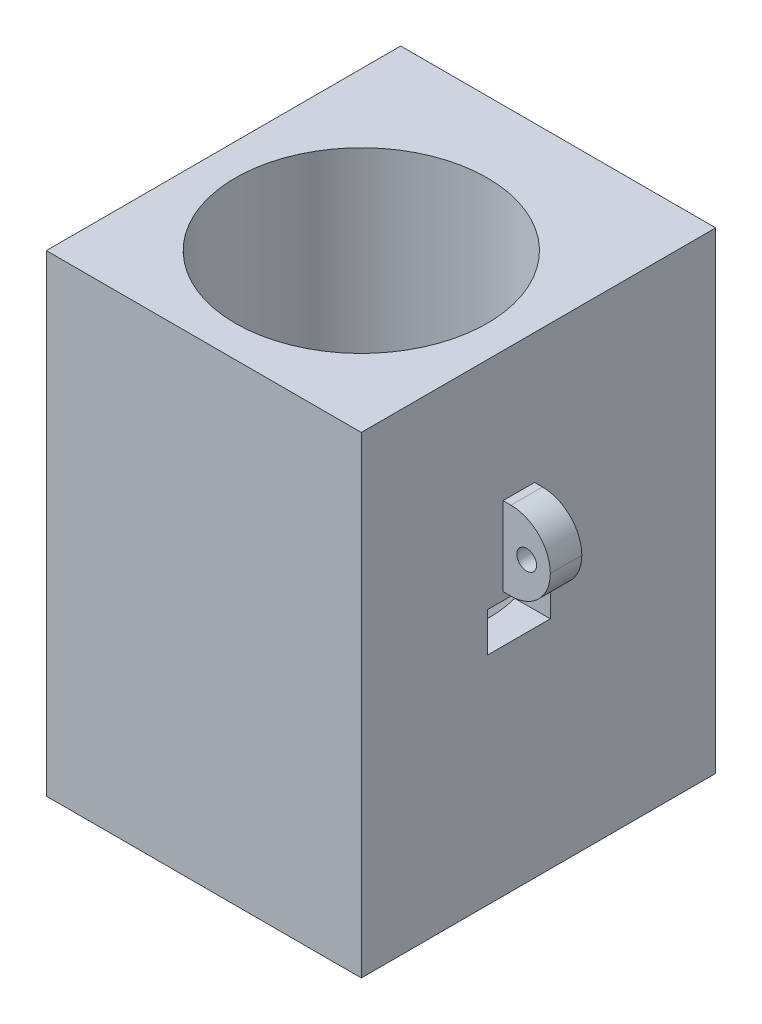
ISO-10303-21;
HEADER;
FILE_DESCRIPTION(('STEP AP214'),'2;1');
FILE_NAME('part.step','',(''),(''),'','','');
FILE_SCHEMA(('AUTOMOTIVE_DESIGN { 1 0 10303 214 1 1 1 1 }'));
ENDSEC;
DATA;
#1=APPLICATION_CONTEXT('core data for automotive mechanical design processes');
#2=APPLICATION_PROTOCOL_DEFINITION('international standard','automotive_design',2000,#1);
#3=PRODUCT_CONTEXT('',#1,'mechanical');
#4=PRODUCT('Part','Part','',(#3));
#5=PRODUCT_RELATED_PRODUCT_CATEGORY('part','',(#4));
#6=PRODUCT_DEFINITION_FORMATION('','',#4);
#7=PRODUCT_DEFINITION_CONTEXT('part definition',#1,'design');
#8=PRODUCT_DEFINITION('design','',#6,#7);
#9=PRODUCT_DEFINITION_SHAPE('','',#8);
#10=(LENGTH_UNIT() NAMED_UNIT(*) SI_UNIT(.MILLI.,.METRE.));
#11=(NAMED_UNIT(*) PLANE_ANGLE_UNIT() SI_UNIT($,.RADIAN.));
#12=(NAMED_UNIT(*) SI_UNIT($,.STERADIAN.) SOLID_ANGLE_UNIT());
#13=UNCERTAINTY_MEASURE_WITH_UNIT(LENGTH_MEASURE(1.E-05),#10,'distance_accuracy_value','');
#14=(GEOMETRIC_REPRESENTATION_CONTEXT(3) GLOBAL_UNCERTAINTY_ASSIGNED_CONTEXT((#13)) GLOBAL_UNIT_ASSIGNED_CONTEXT((#10,
#11,#12)) REPRESENTATION_CONTEXT('',''));
#15=CARTESIAN_POINT('',(0.,0.,0.));
#16=DIRECTION('',(0.,0.,1.));
#17=DIRECTION('',(1.,0.,0.));
#18=AXIS2_PLACEMENT_3D('',#15,#16,#17);
#19=CARTESIAN_POINT('',(20.,30.,-25.));
#20=DIRECTION('',(-1.,0.,0.));
#21=DIRECTION('',(0.,0.,1.));
#22=AXIS2_PLACEMENT_3D('',#19,#20,#21);
#23=PLANE('',#22);
#24=DIRECTION('',(0.,0.,-1.));
#25=VECTOR('',#24,1.);
#26=CARTESIAN_POINT('',(20.,-30.,-25.));
#27=LINE('',#26,#25);
#28=CARTESIAN_POINT('',(20.,-30.,20.));
#29=VERTEX_POINT('',#28);
#30=CARTESIAN_POINT('',(20.,-30.,-25.));
#31=VERTEX_POINT('',#30);
#32=EDGE_CURVE('E300',#29,#31,#27,.T.);
#33=ORIENTED_EDGE('',*,*,#32,.T.);
#34=DIRECTION('',(0.,-1.,0.));
#35=VECTOR('',#34,1.);
#36=CARTESIAN_POINT('',(20.,30.,-25.));
#37=LINE('',#36,#35);
#38=CARTESIAN_POINT('',(20.,30.,-25.));
#39=VERTEX_POINT('',#38);
#40=EDGE_CURVE('E305',#39,#31,#37,.T.);
#41=ORIENTED_EDGE('',*,*,#40,.F.);
#42=DIRECTION('',(0.,0.,-1.));
#43=VECTOR('',#42,1.);
#44=CARTESIAN_POINT('',(20.,30.,-25.));
#45=LINE('',#44,#43);
#46=CARTESIAN_POINT('',(20.,30.,20.));
#47=VERTEX_POINT('',#46);
#48=EDGE_CURVE('E291',#47,#39,#45,.T.);
#49=ORIENTED_EDGE('',*,*,#48,.F.);
#50=DIRECTION('',(0.,-1.,0.));
#51=VECTOR('',#50,1.);
#52=CARTESIAN_POINT('',(20.,30.,20.));
#53=LINE('',#52,#51);
#54=EDGE_CURVE('E308',#47,#29,#53,.T.);
#55=ORIENTED_EDGE('',*,*,#54,.T.);
#56=EDGE_LOOP('',(#33,#41,#49,#55));
#57=FACE_BOUND('',#56,.T.);
#58=DIRECTION('',(0.,0.,-1.));
#59=VECTOR('',#58,1.);
#60=CARTESIAN_POINT('',(20.,2.5,-25.));
#61=LINE('',#60,#59);
#62=CARTESIAN_POINT('',(20.,2.5,4.));
#63=VERTEX_POINT('',#62);
#64=CARTESIAN_POINT('',(20.,2.5,-4.));
#65=VERTEX_POINT('',#64);
#66=EDGE_CURVE('E254',#63,#65,#61,.T.);
#67=ORIENTED_EDGE('',*,*,#66,.T.);
#68=DIRECTION('',(0.,-1.,0.));
#69=VECTOR('',#68,1.);
#70=CARTESIAN_POINT('',(20.,30.,-4.));
#71=LINE('',#70,#69);
#72=CARTESIAN_POINT('',(20.,-2.5,-4.));
#73=VERTEX_POINT('',#72);
#74=EDGE_CURVE('E272',#65,#73,#71,.T.);
#75=ORIENTED_EDGE('',*,*,#74,.T.);
#76=DIRECTION('',(0.,0.,1.));
#77=VECTOR('',#76,1.);
#78=CARTESIAN_POINT('',(20.,-2.5,-25.));
#79=LINE('',#78,#77);
#80=CARTESIAN_POINT('',(20.,-2.5,4.));
#81=VERTEX_POINT('',#80);
#82=EDGE_CURVE('E266',#73,#81,#79,.T.);
#83=ORIENTED_EDGE('',*,*,#82,.T.);
#84=DIRECTION('',(0.,1.,0.));
#85=VECTOR('',#84,1.);
#86=CARTESIAN_POINT('',(20.,30.,4.));
#87=LINE('',#86,#85);
#88=EDGE_CURVE('E260',#81,#63,#87,.T.);
#89=ORIENTED_EDGE('',*,*,#88,.T.);
#90=EDGE_LOOP('',(#67,#75,#83,#89));
#91=FACE_BOUND('',#90,.T.);
#92=DIRECTION('',(0.,0.,-1.));
#93=VECTOR('',#92,1.);
#94=CARTESIAN_POINT('',(20.,13.5,2.));
#95=LINE('',#94,#93);
#96=CARTESIAN_POINT('',(20.,13.5,2.));
#97=VERTEX_POINT('',#96);
#98=CARTESIAN_POINT('',(20.,13.5,-2.));
#99=VERTEX_POINT('',#98);
#100=EDGE_CURVE('E186',#97,#99,#95,.T.);
#101=ORIENTED_EDGE('',*,*,#100,.T.);
#102=DIRECTION('',(0.,-1.,0.));
#103=VECTOR('',#102,1.);
#104=CARTESIAN_POINT('',(20.,3.5,-2.));
#105=LINE('',#104,#103);
#106=CARTESIAN_POINT('',(20.,3.5,-2.));
#107=VERTEX_POINT('',#106);
#108=EDGE_CURVE('E180',#99,#107,#105,.T.);
#109=ORIENTED_EDGE('',*,*,#108,.T.);
#110=DIRECTION('',(0.,0.,-1.));
#111=VECTOR('',#110,1.);
#112=CARTESIAN_POINT('',(20.,3.5,2.));
#113=LINE('',#112,#111);
#114=CARTESIAN_POINT('',(20.,3.5,2.));
#115=VERTEX_POINT('',#114);
#116=EDGE_CURVE('E183',#115,#107,#113,.T.);
#117=ORIENTED_EDGE('',*,*,#116,.F.);
#118=DIRECTION('',(0.,-1.,0.));
#119=VECTOR('',#118,1.);
#120=CARTESIAN_POINT('',(20.,3.5,2.));
#121=LINE('',#120,#119);
#122=EDGE_CURVE('E207',#97,#115,#121,.T.);
#123=ORIENTED_EDGE('',*,*,#122,.F.);
#124=EDGE_LOOP('',(#101,#109,#117,#123));
#125=FACE_BOUND('',#124,.T.);
#126=ADVANCED_FACE('F33',(#57,#91,#125),#23,.F.);
#127=CARTESIAN_POINT('',(-20.,30.,-25.));
#128=DIRECTION('',(1.,0.,0.));
#129=DIRECTION('',(0.,0.,-1.));
#130=AXIS2_PLACEMENT_3D('',#127,#128,#129);
#131=PLANE('',#130);
#132=DIRECTION('',(0.,0.,1.));
#133=VECTOR('',#132,1.);
#134=CARTESIAN_POINT('',(-20.,-30.,-25.));
#135=LINE('',#134,#133);
#136=CARTESIAN_POINT('',(-20.,-30.,-25.));
#137=VERTEX_POINT('',#136);
#138=CARTESIAN_POINT('',(-20.,-30.,20.));
#139=VERTEX_POINT('',#138);
#140=EDGE_CURVE('E282',#137,#139,#135,.T.);
#141=ORIENTED_EDGE('',*,*,#140,.T.);
#142=DIRECTION('',(0.,-1.,0.));
#143=VECTOR('',#142,1.);
#144=CARTESIAN_POINT('',(-20.,30.,20.));
#145=LINE('',#144,#143);
#146=CARTESIAN_POINT('',(-20.,30.,20.));
#147=VERTEX_POINT('',#146);
#148=EDGE_CURVE('E311',#147,#139,#145,.T.);
#149=ORIENTED_EDGE('',*,*,#148,.F.);
#150=DIRECTION('',(0.,0.,1.));
#151=VECTOR('',#150,1.);
#152=CARTESIAN_POINT('',(-20.,30.,-25.));
#153=LINE('',#152,#151);
#154=CARTESIAN_POINT('',(-20.,30.,-25.));
#155=VERTEX_POINT('',#154);
#156=EDGE_CURVE('E285',#155,#147,#153,.T.);
#157=ORIENTED_EDGE('',*,*,#156,.F.);
#158=DIRECTION('',(0.,-1.,0.));
#159=VECTOR('',#158,1.);
#160=CARTESIAN_POINT('',(-20.,30.,-25.));
#161=LINE('',#160,#159);
#162=EDGE_CURVE('E295',#155,#137,#161,.T.);
#163=ORIENTED_EDGE('',*,*,#162,.T.);
#164=EDGE_LOOP('',(#141,#149,#157,#163));
#165=FACE_BOUND('',#164,.T.);
#166=DIRECTION('',(0.,0.,-1.));
#167=VECTOR('',#166,1.);
#168=CARTESIAN_POINT('',(-20.,-2.5,-25.));
#169=LINE('',#168,#167);
#170=CARTESIAN_POINT('',(-20.,-2.5,4.));
#171=VERTEX_POINT('',#170);
#172=CARTESIAN_POINT('',(-20.,-2.5,-4.));
#173=VERTEX_POINT('',#172);
#174=EDGE_CURVE('E269',#171,#173,#169,.T.);
#175=ORIENTED_EDGE('',*,*,#174,.T.);
#176=DIRECTION('',(0.,1.,0.));
#177=VECTOR('',#176,1.);
#178=CARTESIAN_POINT('',(-20.,30.,-4.));
#179=LINE('',#178,#177);
#180=CARTESIAN_POINT('',(-20.,2.5,-4.));
#181=VERTEX_POINT('',#180);
#182=EDGE_CURVE('E275',#173,#181,#179,.T.);
#183=ORIENTED_EDGE('',*,*,#182,.T.);
#184=DIRECTION('',(0.,0.,1.));
#185=VECTOR('',#184,1.);
#186=CARTESIAN_POINT('',(-20.,2.5,-25.));
#187=LINE('',#186,#185);
#188=CARTESIAN_POINT('',(-20.,2.5,4.));
#189=VERTEX_POINT('',#188);
#190=EDGE_CURVE('E257',#181,#189,#187,.T.);
#191=ORIENTED_EDGE('',*,*,#190,.T.);
#192=DIRECTION('',(0.,-1.,0.));
#193=VECTOR('',#192,1.);
#194=CARTESIAN_POINT('',(-20.,30.,4.));
#195=LINE('',#194,#193);
#196=EDGE_CURVE('E263',#189,#171,#195,.T.);
#197=ORIENTED_EDGE('',*,*,#196,.T.);
#198=EDGE_LOOP('',(#175,#183,#191,#197));
#199=FACE_BOUND('',#198,.T.);
#200=DIRECTION('',(0.,0.,-1.));
#201=VECTOR('',#200,1.);
#202=CARTESIAN_POINT('',(-20.,13.5,2.));
#203=LINE('',#202,#201);
#204=CARTESIAN_POINT('',(-20.,13.5,2.));
#205=VERTEX_POINT('',#204);
#206=CARTESIAN_POINT('',(-20.,13.5,-2.));
#207=VERTEX_POINT('',#206);
#208=EDGE_CURVE('E236',#205,#207,#203,.T.);
#209=ORIENTED_EDGE('',*,*,#208,.F.);
#210=DIRECTION('',(0.,1.,0.));
#211=VECTOR('',#210,1.);
#212=CARTESIAN_POINT('',(-20.,3.5,2.));
#213=LINE('',#212,#211);
#214=CARTESIAN_POINT('',(-20.,3.5,2.));
#215=VERTEX_POINT('',#214);
#216=EDGE_CURVE('E219',#215,#205,#213,.T.);
#217=ORIENTED_EDGE('',*,*,#216,.F.);
#218=DIRECTION('',(0.,0.,-1.));
#219=VECTOR('',#218,1.);
#220=CARTESIAN_POINT('',(-20.,3.5,2.));
#221=LINE('',#220,#219);
#222=CARTESIAN_POINT('',(-20.,3.5,-2.));
#223=VERTEX_POINT('',#222);
#224=EDGE_CURVE('E228',#215,#223,#221,.T.);
#225=ORIENTED_EDGE('',*,*,#224,.T.);
#226=DIRECTION('',(0.,1.,0.));
#227=VECTOR('',#226,1.);
#228=CARTESIAN_POINT('',(-20.,3.5,-2.));
#229=LINE('',#228,#227);
#230=EDGE_CURVE('E216',#223,#207,#229,.T.);
#231=ORIENTED_EDGE('',*,*,#230,.T.);
#232=EDGE_LOOP('',(#209,#217,#225,#231));
#233=FACE_BOUND('',#232,.T.);
#234=ADVANCED_FACE('F392',(#165,#199,#233),#131,.F.);
#235=CARTESIAN_POINT('',(0.,30.,0.));
#236=DIRECTION('',(0.,1.,0.));
#237=DIRECTION('',(0.,0.,1.));
#238=AXIS2_PLACEMENT_3D('',#235,#236,#237);
#239=PLANE('',#238);
#240=ORIENTED_EDGE('',*,*,#156,.T.);
#241=DIRECTION('',(1.,0.,0.));
#242=VECTOR('',#241,1.);
#243=CARTESIAN_POINT('',(-20.,30.,20.));
#244=LINE('',#243,#242);
#245=EDGE_CURVE('E288',#147,#47,#244,.T.);
#246=ORIENTED_EDGE('',*,*,#245,.T.);
#247=ORIENTED_EDGE('',*,*,#48,.T.);
#248=DIRECTION('',(-1.,0.,0.));
#249=VECTOR('',#248,1.);
#250=CARTESIAN_POINT('',(-20.,30.,-25.));
#251=LINE('',#250,#249);
#252=EDGE_CURVE('E293',#39,#155,#251,.T.);
#253=ORIENTED_EDGE('',*,*,#252,.T.);
#254=EDGE_LOOP('',(#240,#246,#247,#253));
#255=FACE_BOUND('',#254,.T.);
#256=CARTESIAN_POINT('',(0.,30.,0.));
#257=DIRECTION('',(0.,1.,0.));
#258=DIRECTION('',(0.,0.,1.));
#259=AXIS2_PLACEMENT_3D('',#256,#257,#258);
#260=CIRCLE('',#259,16.);
#261=CARTESIAN_POINT('',(0.,30.,16.));
#262=VERTEX_POINT('',#261);
#263=EDGE_CURVE('E279',#262,#262,#260,.T.);
#264=ORIENTED_EDGE('',*,*,#263,.F.);
#265=EDGE_LOOP('',(#264));
#266=FACE_BOUND('',#265,.T.);
#267=ADVANCED_FACE('F398',(#255,#266),#239,.T.);
#268=CARTESIAN_POINT('',(0.,-30.,0.));
#269=DIRECTION('',(0.,1.,0.));
#270=DIRECTION('',(0.,0.,1.));
#271=AXIS2_PLACEMENT_3D('',#268,#269,#270);
#272=PLANE('',#271);
#273=ORIENTED_EDGE('',*,*,#140,.F.);
#274=DIRECTION('',(-1.,0.,0.));
#275=VECTOR('',#274,1.);
#276=CARTESIAN_POINT('',(-20.,-30.,-25.));
#277=LINE('',#276,#275);
#278=EDGE_CURVE('E289',#31,#137,#277,.T.);
#279=ORIENTED_EDGE('',*,*,#278,.F.);
#280=ORIENTED_EDGE('',*,*,#32,.F.);
#281=DIRECTION('',(1.,0.,0.));
#282=VECTOR('',#281,1.);
#283=CARTESIAN_POINT('',(-20.,-30.,20.));
#284=LINE('',#283,#282);
#285=EDGE_CURVE('E298',#139,#29,#284,.T.);
#286=ORIENTED_EDGE('',*,*,#285,.F.);
#287=EDGE_LOOP('',(#273,#279,#280,#286));
#288=FACE_BOUND('',#287,.T.);
#289=CARTESIAN_POINT('',(0.,-30.,0.));
#290=DIRECTION('',(0.,1.,0.));
#291=DIRECTION('',(0.,0.,1.));
#292=AXIS2_PLACEMENT_3D('',#289,#290,#291);
#293=CIRCLE('',#292,16.);
#294=CARTESIAN_POINT('',(0.,-30.,16.));
#295=VERTEX_POINT('',#294);
#296=EDGE_CURVE('E278',#295,#295,#293,.T.);
#297=ORIENTED_EDGE('',*,*,#296,.T.);
#298=EDGE_LOOP('',(#297));
#299=FACE_BOUND('',#298,.T.);
#300=ADVANCED_FACE('F408',(#288,#299),#272,.F.);
#301=CARTESIAN_POINT('',(-20.,30.,20.));
#302=DIRECTION('',(0.,0.,-1.));
#303=DIRECTION('',(-1.,0.,0.));
#304=AXIS2_PLACEMENT_3D('',#301,#302,#303);
#305=PLANE('',#304);
#306=ORIENTED_EDGE('',*,*,#285,.T.);
#307=ORIENTED_EDGE('',*,*,#54,.F.);
#308=ORIENTED_EDGE('',*,*,#245,.F.);
#309=ORIENTED_EDGE('',*,*,#148,.T.);
#310=EDGE_LOOP('',(#306,#307,#308,#309));
#311=FACE_BOUND('',#310,.T.);
#312=ADVANCED_FACE('F406',(#311),#305,.F.);
#313=CARTESIAN_POINT('',(-20.,30.,-25.));
#314=DIRECTION('',(0.,0.,1.));
#315=DIRECTION('',(1.,0.,0.));
#316=AXIS2_PLACEMENT_3D('',#313,#314,#315);
#317=PLANE('',#316);
#318=ORIENTED_EDGE('',*,*,#278,.T.);
#319=ORIENTED_EDGE('',*,*,#162,.F.);
#320=ORIENTED_EDGE('',*,*,#252,.F.);
#321=ORIENTED_EDGE('',*,*,#40,.T.);
#322=EDGE_LOOP('',(#318,#319,#320,#321));
#323=FACE_BOUND('',#322,.T.);
#324=ADVANCED_FACE('F404',(#323),#317,.F.);
#325=CARTESIAN_POINT('',(0.,30.,0.));
#326=DIRECTION('',(0.,-1.,0.));
#327=DIRECTION('',(0.,0.,-1.));
#328=AXIS2_PLACEMENT_3D('',#325,#326,#327);
#329=CYLINDRICAL_SURFACE('',#328,16.);
#330=DIRECTION('',(0.,-1.,0.));
#331=VECTOR('',#330,1.);
#332=CARTESIAN_POINT('',(15.4919333848297,30.,-4.));
#333=LINE('',#332,#331);
#334=CARTESIAN_POINT('',(15.4919333848297,2.5,-4.));
#335=VERTEX_POINT('',#334);
#336=CARTESIAN_POINT('',(15.4919333848297,-2.5,-4.));
#337=VERTEX_POINT('',#336);
#338=EDGE_CURVE('E328',#335,#337,#333,.T.);
#339=ORIENTED_EDGE('',*,*,#338,.F.);
#340=CARTESIAN_POINT('',(0.,2.5,0.));
#341=DIRECTION('',(0.,1.,0.));
#342=DIRECTION('',(0.,0.,1.));
#343=AXIS2_PLACEMENT_3D('',#340,#341,#342);
#344=CIRCLE('',#343,16.);
#345=CARTESIAN_POINT('',(15.4919333848297,2.5,4.));
#346=VERTEX_POINT('',#345);
#347=EDGE_CURVE('E317',#346,#335,#344,.T.);
#348=ORIENTED_EDGE('',*,*,#347,.F.);
#349=DIRECTION('',(0.,-1.,0.));
#350=VECTOR('',#349,1.);
#351=CARTESIAN_POINT('',(15.4919333848297,30.,4.));
#352=LINE('',#351,#350);
#353=CARTESIAN_POINT('',(15.4919333848297,-2.5,4.));
#354=VERTEX_POINT('',#353);
#355=EDGE_CURVE('E325',#354,#346,#352,.F.);
#356=ORIENTED_EDGE('',*,*,#355,.F.);
#357=CARTESIAN_POINT('',(0.,-2.5,0.));
#358=DIRECTION('',(0.,-1.,0.));
#359=DIRECTION('',(0.,0.,-1.));
#360=AXIS2_PLACEMENT_3D('',#357,#358,#359);
#361=CIRCLE('',#360,16.);
#362=EDGE_CURVE('E322',#337,#354,#361,.T.);
#363=ORIENTED_EDGE('',*,*,#362,.F.);
#364=EDGE_LOOP('',(#339,#348,#356,#363));
#365=FACE_BOUND('',#364,.T.);
#366=DIRECTION('',(0.,-1.,0.));
#367=VECTOR('',#366,1.);
#368=CARTESIAN_POINT('',(-15.4919333848297,30.,-4.));
#369=LINE('',#368,#367);
#370=CARTESIAN_POINT('',(-15.4919333848297,-2.5,-4.));
#371=VERTEX_POINT('',#370);
#372=CARTESIAN_POINT('',(-15.4919333848297,2.5,-4.));
#373=VERTEX_POINT('',#372);
#374=EDGE_CURVE('E321',#371,#373,#369,.F.);
#375=ORIENTED_EDGE('',*,*,#374,.F.);
#376=CARTESIAN_POINT('',(-15.4919333848297,-2.5,4.));
#377=VERTEX_POINT('',#376);
#378=EDGE_CURVE('E319',#377,#371,#361,.T.);
#379=ORIENTED_EDGE('',*,*,#378,.F.);
#380=DIRECTION('',(0.,-1.,0.));
#381=VECTOR('',#380,1.);
#382=CARTESIAN_POINT('',(-15.4919333848297,30.,4.));
#383=LINE('',#382,#381);
#384=CARTESIAN_POINT('',(-15.4919333848297,2.5,4.));
#385=VERTEX_POINT('',#384);
#386=EDGE_CURVE('E316',#385,#377,#383,.T.);
#387=ORIENTED_EDGE('',*,*,#386,.F.);
#388=EDGE_CURVE('E314',#373,#385,#344,.T.);
#389=ORIENTED_EDGE('',*,*,#388,.F.);
#390=EDGE_LOOP('',(#375,#379,#387,#389));
#391=FACE_BOUND('',#390,.T.);
#392=ORIENTED_EDGE('',*,*,#263,.T.);
#393=EDGE_LOOP('',(#392));
#394=FACE_BOUND('',#393,.T.);
#395=ORIENTED_EDGE('',*,*,#296,.F.);
#396=EDGE_LOOP('',(#395));
#397=FACE_BOUND('',#396,.T.);
#398=ADVANCED_FACE('F559',(#365,#391,#394,#397),#329,.F.);
#399=CARTESIAN_POINT('',(-40.,2.5,4.));
#400=DIRECTION('',(0.,1.,0.));
#401=DIRECTION('',(0.,0.,1.));
#402=AXIS2_PLACEMENT_3D('',#399,#400,#401);
#403=PLANE('',#402);
#404=DIRECTION('',(1.,0.,0.));
#405=VECTOR('',#404,1.);
#406=CARTESIAN_POINT('',(-40.,2.5,-4.));
#407=LINE('',#406,#405);
#408=EDGE_CURVE('E252',#181,#373,#407,.T.);
#409=ORIENTED_EDGE('',*,*,#408,.T.);
#410=ORIENTED_EDGE('',*,*,#388,.T.);
#411=DIRECTION('',(1.,0.,0.));
#412=VECTOR('',#411,1.);
#413=CARTESIAN_POINT('',(-40.,2.5,4.));
#414=LINE('',#413,#412);
#415=EDGE_CURVE('E248',#189,#385,#414,.T.);
#416=ORIENTED_EDGE('',*,*,#415,.F.);
#417=ORIENTED_EDGE('',*,*,#190,.F.);
#418=EDGE_LOOP('',(#409,#410,#416,#417));
#419=FACE_BOUND('',#418,.T.);
#420=ADVANCED_FACE('F509',(#419),#403,.F.);
#421=CARTESIAN_POINT('',(-40.,-2.5,4.));
#422=DIRECTION('',(0.,0.,1.));
#423=DIRECTION('',(1.,0.,0.));
#424=AXIS2_PLACEMENT_3D('',#421,#422,#423);
#425=PLANE('',#424);
#426=ORIENTED_EDGE('',*,*,#415,.T.);
#427=ORIENTED_EDGE('',*,*,#386,.T.);
#428=DIRECTION('',(1.,0.,0.));
#429=VECTOR('',#428,1.);
#430=CARTESIAN_POINT('',(-40.,-2.5,4.));
#431=LINE('',#430,#429);
#432=EDGE_CURVE('E244',#171,#377,#431,.T.);
#433=ORIENTED_EDGE('',*,*,#432,.F.);
#434=ORIENTED_EDGE('',*,*,#196,.F.);
#435=EDGE_LOOP('',(#426,#427,#433,#434));
#436=FACE_BOUND('',#435,.T.);
#437=ADVANCED_FACE('F518',(#436),#425,.F.);
#438=CARTESIAN_POINT('',(-40.,-2.5,4.));
#439=DIRECTION('',(0.,-1.,0.));
#440=DIRECTION('',(0.,0.,-1.));
#441=AXIS2_PLACEMENT_3D('',#438,#439,#440);
#442=PLANE('',#441);
#443=ORIENTED_EDGE('',*,*,#432,.T.);
#444=ORIENTED_EDGE('',*,*,#378,.T.);
#445=DIRECTION('',(1.,0.,0.));
#446=VECTOR('',#445,1.);
#447=CARTESIAN_POINT('',(-40.,-2.5,-4.));
#448=LINE('',#447,#446);
#449=EDGE_CURVE('E243',#173,#371,#448,.T.);
#450=ORIENTED_EDGE('',*,*,#449,.F.);
#451=ORIENTED_EDGE('',*,*,#174,.F.);
#452=EDGE_LOOP('',(#443,#444,#450,#451));
#453=FACE_BOUND('',#452,.T.);
#454=ADVANCED_FACE('F527',(#453),#442,.F.);
#455=CARTESIAN_POINT('',(-40.,-2.5,-4.));
#456=DIRECTION('',(0.,0.,-1.));
#457=DIRECTION('',(-1.,0.,0.));
#458=AXIS2_PLACEMENT_3D('',#455,#456,#457);
#459=PLANE('',#458);
#460=ORIENTED_EDGE('',*,*,#449,.T.);
#461=ORIENTED_EDGE('',*,*,#374,.T.);
#462=ORIENTED_EDGE('',*,*,#408,.F.);
#463=ORIENTED_EDGE('',*,*,#182,.F.);
#464=EDGE_LOOP('',(#460,#461,#462,#463));
#465=FACE_BOUND('',#464,.T.);
#466=ADVANCED_FACE('F533',(#465),#459,.F.);
#467=EDGE_CURVE('E239',#335,#65,#407,.T.);
#468=ORIENTED_EDGE('',*,*,#467,.F.);
#469=ORIENTED_EDGE('',*,*,#338,.T.);
#470=EDGE_CURVE('E240',#337,#73,#448,.T.);
#471=ORIENTED_EDGE('',*,*,#470,.T.);
#472=ORIENTED_EDGE('',*,*,#74,.F.);
#473=EDGE_LOOP('',(#468,#469,#471,#472));
#474=FACE_BOUND('',#473,.T.);
#475=ADVANCED_FACE('F524',(#474),#459,.F.);
#476=ORIENTED_EDGE('',*,*,#470,.F.);
#477=ORIENTED_EDGE('',*,*,#362,.T.);
#478=EDGE_CURVE('E245',#354,#81,#431,.T.);
#479=ORIENTED_EDGE('',*,*,#478,.T.);
#480=ORIENTED_EDGE('',*,*,#82,.F.);
#481=EDGE_LOOP('',(#476,#477,#479,#480));
#482=FACE_BOUND('',#481,.T.);
#483=ADVANCED_FACE('F515',(#482),#442,.F.);
#484=ORIENTED_EDGE('',*,*,#478,.F.);
#485=ORIENTED_EDGE('',*,*,#355,.T.);
#486=EDGE_CURVE('E249',#346,#63,#414,.T.);
#487=ORIENTED_EDGE('',*,*,#486,.T.);
#488=ORIENTED_EDGE('',*,*,#88,.F.);
#489=EDGE_LOOP('',(#484,#485,#487,#488));
#490=FACE_BOUND('',#489,.T.);
#491=ADVANCED_FACE('F506',(#490),#425,.F.);
#492=ORIENTED_EDGE('',*,*,#486,.F.);
#493=ORIENTED_EDGE('',*,*,#347,.T.);
#494=ORIENTED_EDGE('',*,*,#467,.T.);
#495=ORIENTED_EDGE('',*,*,#66,.F.);
#496=EDGE_LOOP('',(#492,#493,#494,#495));
#497=FACE_BOUND('',#496,.T.);
#498=ADVANCED_FACE('F495',(#497),#403,.F.);
#499=CARTESIAN_POINT('',(0.,0.,2.));
#500=DIRECTION('',(0.,0.,-1.));
#501=DIRECTION('',(-1.,0.,0.));
#502=AXIS2_PLACEMENT_3D('',#499,#500,#501);
#503=PLANE('',#502);
#504=CARTESIAN_POINT('',(-21.,8.5,2.));
#505=DIRECTION('',(0.,0.,-1.));
#506=DIRECTION('',(-1.,0.,0.));
#507=AXIS2_PLACEMENT_3D('',#504,#505,#506);
#508=CIRCLE('',#507,5.);
#509=CARTESIAN_POINT('',(-21.,13.5,2.));
#510=VERTEX_POINT('',#509);
#511=CARTESIAN_POINT('',(-26.,8.5,2.));
#512=VERTEX_POINT('',#511);
#513=EDGE_CURVE('E337',#510,#512,#508,.F.);
#514=ORIENTED_EDGE('',*,*,#513,.T.);
#515=CARTESIAN_POINT('',(-21.,8.5,2.));
#516=DIRECTION('',(0.,0.,-1.));
#517=DIRECTION('',(-1.,0.,0.));
#518=AXIS2_PLACEMENT_3D('',#515,#516,#517);
#519=CIRCLE('',#518,5.);
#520=CARTESIAN_POINT('',(-21.,3.5,2.));
#521=VERTEX_POINT('',#520);
#522=EDGE_CURVE('E339',#512,#521,#519,.F.);
#523=ORIENTED_EDGE('',*,*,#522,.T.);
#524=DIRECTION('',(1.,0.,0.));
#525=VECTOR('',#524,1.);
#526=CARTESIAN_POINT('',(-26.,3.5,2.));
#527=LINE('',#526,#525);
#528=EDGE_CURVE('E226',#521,#215,#527,.T.);
#529=ORIENTED_EDGE('',*,*,#528,.T.);
#530=ORIENTED_EDGE('',*,*,#216,.T.);
#531=DIRECTION('',(-1.,0.,0.));
#532=VECTOR('',#531,1.);
#533=CARTESIAN_POINT('',(-26.,13.5,2.));
#534=LINE('',#533,#532);
#535=EDGE_CURVE('E222',#205,#510,#534,.T.);
#536=ORIENTED_EDGE('',*,*,#535,.T.);
#537=EDGE_LOOP('',(#514,#523,#529,#530,#536));
#538=FACE_BOUND('',#537,.T.);
#539=CARTESIAN_POINT('',(-23.,8.5,2.));
#540=DIRECTION('',(0.,0.,1.));
#541=DIRECTION('',(1.,0.,0.));
#542=AXIS2_PLACEMENT_3D('',#539,#540,#541);
#543=CIRCLE('',#542,1.25);
#544=CARTESIAN_POINT('',(-21.75,8.5,2.));
#545=VERTEX_POINT('',#544);
#546=EDGE_CURVE('E213',#545,#545,#543,.T.);
#547=ORIENTED_EDGE('',*,*,#546,.F.);
#548=EDGE_LOOP('',(#547));
#549=FACE_BOUND('',#548,.T.);
#550=ADVANCED_FACE('F486',(#538,#549),#503,.F.);
#551=CARTESIAN_POINT('',(0.,0.,-2.));
#552=DIRECTION('',(0.,0.,-1.));
#553=DIRECTION('',(-1.,0.,0.));
#554=AXIS2_PLACEMENT_3D('',#551,#552,#553);
#555=PLANE('',#554);
#556=DIRECTION('',(1.,0.,0.));
#557=VECTOR('',#556,1.);
#558=CARTESIAN_POINT('',(-26.,3.5,-2.));
#559=LINE('',#558,#557);
#560=CARTESIAN_POINT('',(-21.,3.5,-2.));
#561=VERTEX_POINT('',#560);
#562=EDGE_CURVE('E223',#561,#223,#559,.T.);
#563=ORIENTED_EDGE('',*,*,#562,.F.);
#564=CARTESIAN_POINT('',(-21.,8.5,-2.));
#565=DIRECTION('',(0.,0.,-1.));
#566=DIRECTION('',(-1.,0.,0.));
#567=AXIS2_PLACEMENT_3D('',#564,#565,#566);
#568=CIRCLE('',#567,5.);
#569=CARTESIAN_POINT('',(-26.,8.5,-2.));
#570=VERTEX_POINT('',#569);
#571=EDGE_CURVE('E335',#561,#570,#568,.T.);
#572=ORIENTED_EDGE('',*,*,#571,.T.);
#573=CARTESIAN_POINT('',(-21.,8.5,-2.));
#574=DIRECTION('',(0.,0.,-1.));
#575=DIRECTION('',(-1.,0.,0.));
#576=AXIS2_PLACEMENT_3D('',#573,#574,#575);
#577=CIRCLE('',#576,5.);
#578=CARTESIAN_POINT('',(-21.,13.5,-2.));
#579=VERTEX_POINT('',#578);
#580=EDGE_CURVE('E333',#570,#579,#577,.T.);
#581=ORIENTED_EDGE('',*,*,#580,.T.);
#582=DIRECTION('',(-1.,0.,0.));
#583=VECTOR('',#582,1.);
#584=CARTESIAN_POINT('',(-26.,13.5,-2.));
#585=LINE('',#584,#583);
#586=EDGE_CURVE('E230',#207,#579,#585,.T.);
#587=ORIENTED_EDGE('',*,*,#586,.F.);
#588=ORIENTED_EDGE('',*,*,#230,.F.);
#589=EDGE_LOOP('',(#563,#572,#581,#587,#588));
#590=FACE_BOUND('',#589,.T.);
#591=CARTESIAN_POINT('',(-23.,8.5,-2.));
#592=DIRECTION('',(0.,0.,1.));
#593=DIRECTION('',(1.,0.,0.));
#594=AXIS2_PLACEMENT_3D('',#591,#592,#593);
#595=CIRCLE('',#594,1.25);
#596=CARTESIAN_POINT('',(-21.75,8.5,-2.));
#597=VERTEX_POINT('',#596);
#598=EDGE_CURVE('E212',#597,#597,#595,.T.);
#599=ORIENTED_EDGE('',*,*,#598,.T.);
#600=EDGE_LOOP('',(#599));
#601=FACE_BOUND('',#600,.T.);
#602=ADVANCED_FACE('F477',(#590,#601),#555,.T.);
#603=CARTESIAN_POINT('',(-26.,13.5,2.));
#604=DIRECTION('',(0.,-1.,0.));
#605=DIRECTION('',(0.,0.,-1.));
#606=AXIS2_PLACEMENT_3D('',#603,#604,#605);
#607=PLANE('',#606);
#608=ORIENTED_EDGE('',*,*,#586,.T.);
#609=DIRECTION('',(0.,0.,-1.));
#610=VECTOR('',#609,1.);
#611=CARTESIAN_POINT('',(-21.,13.5,2.));
#612=LINE('',#611,#610);
#613=EDGE_CURVE('E341',#579,#510,#612,.F.);
#614=ORIENTED_EDGE('',*,*,#613,.T.);
#615=ORIENTED_EDGE('',*,*,#535,.F.);
#616=ORIENTED_EDGE('',*,*,#208,.T.);
#617=EDGE_LOOP('',(#608,#614,#615,#616));
#618=FACE_BOUND('',#617,.T.);
#619=ADVANCED_FACE('F467',(#618),#607,.F.);
#620=CARTESIAN_POINT('',(-26.,3.5,2.));
#621=DIRECTION('',(0.,1.,0.));
#622=DIRECTION('',(0.,0.,1.));
#623=AXIS2_PLACEMENT_3D('',#620,#621,#622);
#624=PLANE('',#623);
#625=ORIENTED_EDGE('',*,*,#528,.F.);
#626=DIRECTION('',(0.,0.,-1.));
#627=VECTOR('',#626,1.);
#628=CARTESIAN_POINT('',(-21.,3.5,2.));
#629=LINE('',#628,#627);
#630=EDGE_CURVE('E330',#521,#561,#629,.T.);
#631=ORIENTED_EDGE('',*,*,#630,.T.);
#632=ORIENTED_EDGE('',*,*,#562,.T.);
#633=ORIENTED_EDGE('',*,*,#224,.F.);
#634=EDGE_LOOP('',(#625,#631,#632,#633));
#635=FACE_BOUND('',#634,.T.);
#636=ADVANCED_FACE('F462',(#635),#624,.F.);
#637=CARTESIAN_POINT('',(-23.,8.5,2.));
#638=DIRECTION('',(0.,0.,-1.));
#639=DIRECTION('',(-1.,0.,0.));
#640=AXIS2_PLACEMENT_3D('',#637,#638,#639);
#641=CYLINDRICAL_SURFACE('',#640,1.25);
#642=ORIENTED_EDGE('',*,*,#546,.T.);
#643=EDGE_LOOP('',(#642));
#644=FACE_BOUND('',#643,.T.);
#645=ORIENTED_EDGE('',*,*,#598,.F.);
#646=EDGE_LOOP('',(#645));
#647=FACE_BOUND('',#646,.T.);
#648=ADVANCED_FACE('F374',(#644,#647),#641,.F.);
#649=CARTESIAN_POINT('',(0.,0.,2.));
#650=DIRECTION('',(0.,0.,1.));
#651=DIRECTION('',(1.,0.,0.));
#652=AXIS2_PLACEMENT_3D('',#649,#650,#651);
#653=PLANE('',#652);
#654=DIRECTION('',(1.,0.,0.));
#655=VECTOR('',#654,1.);
#656=CARTESIAN_POINT('',(26.,3.5,2.));
#657=LINE('',#656,#655);
#658=CARTESIAN_POINT('',(21.,3.5,2.));
#659=VERTEX_POINT('',#658);
#660=EDGE_CURVE('E199',#115,#659,#657,.T.);
#661=ORIENTED_EDGE('',*,*,#660,.T.);
#662=CARTESIAN_POINT('',(21.,8.5,2.));
#663=DIRECTION('',(0.,0.,1.));
#664=DIRECTION('',(1.,0.,0.));
#665=AXIS2_PLACEMENT_3D('',#662,#663,#664);
#666=CIRCLE('',#665,5.);
#667=CARTESIAN_POINT('',(26.,8.5,2.));
#668=VERTEX_POINT('',#667);
#669=EDGE_CURVE('E42',#659,#668,#666,.T.);
#670=ORIENTED_EDGE('',*,*,#669,.T.);
#671=CARTESIAN_POINT('',(21.,8.5,2.));
#672=DIRECTION('',(0.,0.,1.));
#673=DIRECTION('',(1.,0.,0.));
#674=AXIS2_PLACEMENT_3D('',#671,#672,#673);
#675=CIRCLE('',#674,5.);
#676=CARTESIAN_POINT('',(21.,13.5,2.));
#677=VERTEX_POINT('',#676);
#678=EDGE_CURVE('E50',#668,#677,#675,.T.);
#679=ORIENTED_EDGE('',*,*,#678,.T.);
#680=DIRECTION('',(-1.,0.,0.));
#681=VECTOR('',#680,1.);
#682=CARTESIAN_POINT('',(26.,13.5,2.));
#683=LINE('',#682,#681);
#684=EDGE_CURVE('E205',#677,#97,#683,.T.);
#685=ORIENTED_EDGE('',*,*,#684,.T.);
#686=ORIENTED_EDGE('',*,*,#122,.T.);
#687=EDGE_LOOP('',(#661,#670,#679,#685,#686));
#688=FACE_BOUND('',#687,.T.);
#689=CARTESIAN_POINT('',(23.,8.5,2.));
#690=DIRECTION('',(0.,0.,1.));
#691=DIRECTION('',(-1.,0.,0.));
#692=AXIS2_PLACEMENT_3D('',#689,#690,#691);
#693=CIRCLE('',#692,1.25);
#694=CARTESIAN_POINT('',(21.75,8.5,2.));
#695=VERTEX_POINT('',#694);
#696=EDGE_CURVE('E356',#695,#695,#693,.T.);
#697=ORIENTED_EDGE('',*,*,#696,.F.);
#698=EDGE_LOOP('',(#697));
#699=FACE_BOUND('',#698,.T.);
#700=ADVANCED_FACE('F371',(#688,#699),#653,.T.);
#701=CARTESIAN_POINT('',(0.,0.,-2.));
#702=DIRECTION('',(0.,0.,1.));
#703=DIRECTION('',(1.,0.,0.));
#704=AXIS2_PLACEMENT_3D('',#701,#702,#703);
#705=PLANE('',#704);
#706=CARTESIAN_POINT('',(21.,8.5,-2.));
#707=DIRECTION('',(0.,0.,1.));
#708=DIRECTION('',(1.,0.,0.));
#709=AXIS2_PLACEMENT_3D('',#706,#707,#708);
#710=CIRCLE('',#709,5.);
#711=CARTESIAN_POINT('',(21.,13.5,-2.));
#712=VERTEX_POINT('',#711);
#713=CARTESIAN_POINT('',(26.,8.5,-2.));
#714=VERTEX_POINT('',#713);
#715=EDGE_CURVE('E343',#712,#714,#710,.F.);
#716=ORIENTED_EDGE('',*,*,#715,.T.);
#717=CARTESIAN_POINT('',(21.,8.5,-2.));
#718=DIRECTION('',(0.,0.,1.));
#719=DIRECTION('',(1.,0.,0.));
#720=AXIS2_PLACEMENT_3D('',#717,#718,#719);
#721=CIRCLE('',#720,5.);
#722=CARTESIAN_POINT('',(21.,3.5,-2.));
#723=VERTEX_POINT('',#722);
#724=EDGE_CURVE('E204',#714,#723,#721,.F.);
#725=ORIENTED_EDGE('',*,*,#724,.T.);
#726=DIRECTION('',(1.,0.,0.));
#727=VECTOR('',#726,1.);
#728=CARTESIAN_POINT('',(26.,3.5,-2.));
#729=LINE('',#728,#727);
#730=EDGE_CURVE('E190',#107,#723,#729,.T.);
#731=ORIENTED_EDGE('',*,*,#730,.F.);
#732=ORIENTED_EDGE('',*,*,#108,.F.);
#733=DIRECTION('',(-1.,0.,0.));
#734=VECTOR('',#733,1.);
#735=CARTESIAN_POINT('',(26.,13.5,-2.));
#736=LINE('',#735,#734);
#737=EDGE_CURVE('E191',#712,#99,#736,.T.);
#738=ORIENTED_EDGE('',*,*,#737,.F.);
#739=EDGE_LOOP('',(#716,#725,#731,#732,#738));
#740=FACE_BOUND('',#739,.T.);
#741=CARTESIAN_POINT('',(23.,8.5,-2.));
#742=DIRECTION('',(0.,0.,1.));
#743=DIRECTION('',(-1.,0.,0.));
#744=AXIS2_PLACEMENT_3D('',#741,#742,#743);
#745=CIRCLE('',#744,1.25);
#746=CARTESIAN_POINT('',(21.75,8.5,-2.));
#747=VERTEX_POINT('',#746);
#748=EDGE_CURVE('E351',#747,#747,#745,.T.);
#749=ORIENTED_EDGE('',*,*,#748,.T.);
#750=EDGE_LOOP('',(#749));
#751=FACE_BOUND('',#750,.T.);
#752=ADVANCED_FACE('F201',(#740,#751),#705,.F.);
#753=CARTESIAN_POINT('',(26.,13.5,2.));
#754=DIRECTION('',(0.,-1.,0.));
#755=DIRECTION('',(0.,0.,-1.));
#756=AXIS2_PLACEMENT_3D('',#753,#754,#755);
#757=PLANE('',#756);
#758=ORIENTED_EDGE('',*,*,#684,.F.);
#759=DIRECTION('',(0.,0.,-1.));
#760=VECTOR('',#759,1.);
#761=CARTESIAN_POINT('',(21.,13.5,2.));
#762=LINE('',#761,#760);
#763=EDGE_CURVE('E11',#677,#712,#762,.T.);
#764=ORIENTED_EDGE('',*,*,#763,.T.);
#765=ORIENTED_EDGE('',*,*,#737,.T.);
#766=ORIENTED_EDGE('',*,*,#100,.F.);
#767=EDGE_LOOP('',(#758,#764,#765,#766));
#768=FACE_BOUND('',#767,.T.);
#769=ADVANCED_FACE('F366',(#768),#757,.F.);
#770=CARTESIAN_POINT('',(26.,3.5,2.));
#771=DIRECTION('',(0.,1.,0.));
#772=DIRECTION('',(0.,0.,1.));
#773=AXIS2_PLACEMENT_3D('',#770,#771,#772);
#774=PLANE('',#773);
#775=ORIENTED_EDGE('',*,*,#730,.T.);
#776=DIRECTION('',(0.,0.,-1.));
#777=VECTOR('',#776,1.);
#778=CARTESIAN_POINT('',(21.,3.5,2.));
#779=LINE('',#778,#777);
#780=EDGE_CURVE('E346',#723,#659,#779,.F.);
#781=ORIENTED_EDGE('',*,*,#780,.T.);
#782=ORIENTED_EDGE('',*,*,#660,.F.);
#783=ORIENTED_EDGE('',*,*,#116,.T.);
#784=EDGE_LOOP('',(#775,#781,#782,#783));
#785=FACE_BOUND('',#784,.T.);
#786=ADVANCED_FACE('F196',(#785),#774,.F.);
#787=CARTESIAN_POINT('',(23.,8.5,2.));
#788=DIRECTION('',(0.,0.,-1.));
#789=DIRECTION('',(-1.,0.,0.));
#790=AXIS2_PLACEMENT_3D('',#787,#788,#789);
#791=CYLINDRICAL_SURFACE('',#790,1.25);
#792=ORIENTED_EDGE('',*,*,#696,.T.);
#793=EDGE_LOOP('',(#792));
#794=FACE_BOUND('',#793,.T.);
#795=ORIENTED_EDGE('',*,*,#748,.F.);
#796=EDGE_LOOP('',(#795));
#797=FACE_BOUND('',#796,.T.);
#798=ADVANCED_FACE('F378',(#794,#797),#791,.F.);
#799=CARTESIAN_POINT('',(-21.,8.5,2.));
#800=DIRECTION('',(0.,0.,-1.));
#801=DIRECTION('',(-1.,0.,0.));
#802=AXIS2_PLACEMENT_3D('',#799,#800,#801);
#803=CYLINDRICAL_SURFACE('',#802,5.);
#804=DIRECTION('',(0.,0.,-1.));
#805=VECTOR('',#804,1.);
#806=CARTESIAN_POINT('',(-26.,8.5,2.));
#807=LINE('',#806,#805);
#808=EDGE_CURVE('E349',#512,#570,#807,.T.);
#809=ORIENTED_EDGE('',*,*,#808,.F.);
#810=ORIENTED_EDGE('',*,*,#513,.F.);
#811=ORIENTED_EDGE('',*,*,#613,.F.);
#812=ORIENTED_EDGE('',*,*,#580,.F.);
#813=EDGE_LOOP('',(#809,#810,#811,#812));
#814=FACE_BOUND('',#813,.T.);
#815=ADVANCED_FACE('F381',(#814),#803,.T.);
#816=CARTESIAN_POINT('',(-21.,8.5,2.));
#817=DIRECTION('',(0.,0.,-1.));
#818=DIRECTION('',(-1.,0.,0.));
#819=AXIS2_PLACEMENT_3D('',#816,#817,#818);
#820=CYLINDRICAL_SURFACE('',#819,5.);
#821=ORIENTED_EDGE('',*,*,#522,.F.);
#822=ORIENTED_EDGE('',*,*,#808,.T.);
#823=ORIENTED_EDGE('',*,*,#571,.F.);
#824=ORIENTED_EDGE('',*,*,#630,.F.);
#825=EDGE_LOOP('',(#821,#822,#823,#824));
#826=FACE_BOUND('',#825,.T.);
#827=ADVANCED_FACE('F411',(#826),#820,.T.);
#828=CARTESIAN_POINT('',(21.,8.5,2.));
#829=DIRECTION('',(0.,0.,-1.));
#830=DIRECTION('',(-1.,0.,0.));
#831=AXIS2_PLACEMENT_3D('',#828,#829,#830);
#832=CYLINDRICAL_SURFACE('',#831,5.);
#833=ORIENTED_EDGE('',*,*,#763,.F.);
#834=ORIENTED_EDGE('',*,*,#678,.F.);
#835=DIRECTION('',(0.,0.,-1.));
#836=VECTOR('',#835,1.);
#837=CARTESIAN_POINT('',(26.,8.5,2.));
#838=LINE('',#837,#836);
#839=EDGE_CURVE('E37',#714,#668,#838,.F.);
#840=ORIENTED_EDGE('',*,*,#839,.F.);
#841=ORIENTED_EDGE('',*,*,#715,.F.);
#842=EDGE_LOOP('',(#833,#834,#840,#841));
#843=FACE_BOUND('',#842,.T.);
#844=ADVANCED_FACE('F35',(#843),#832,.T.);
#845=CARTESIAN_POINT('',(21.,8.5,2.));
#846=DIRECTION('',(0.,0.,-1.));
#847=DIRECTION('',(-1.,0.,0.));
#848=AXIS2_PLACEMENT_3D('',#845,#846,#847);
#849=CYLINDRICAL_SURFACE('',#848,5.);
#850=ORIENTED_EDGE('',*,*,#669,.F.);
#851=ORIENTED_EDGE('',*,*,#780,.F.);
#852=ORIENTED_EDGE('',*,*,#724,.F.);
#853=ORIENTED_EDGE('',*,*,#839,.T.);
#854=EDGE_LOOP('',(#850,#851,#852,#853));
#855=FACE_BOUND('',#854,.T.);
#856=ADVANCED_FACE('F361',(#855),#849,.T.);
#857=CLOSED_SHELL('',(#126,#234,#267,#300,#312,#324,#398,#420,#437,#454,#466,#475,#483,#491,
#498,#550,#602,#619,#636,#648,#700,#752,#769,#786,#798,#815,#827,#844,#856));
#858=MANIFOLD_SOLID_BREP('B2',#857);
#859=ADVANCED_BREP_SHAPE_REPRESENTATION('',(#18,#858),#14);
#860=SHAPE_DEFINITION_REPRESENTATION(#9,#859);
ENDSEC;
END-ISO-10303-21;
